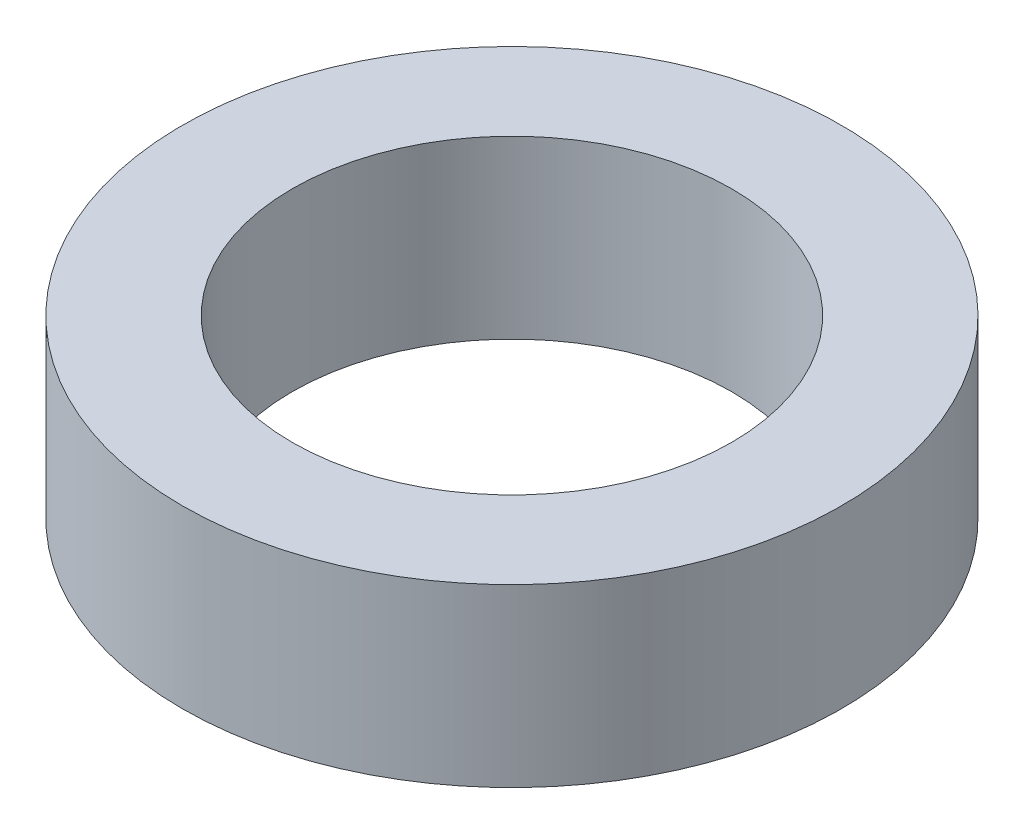
ISO-10303-21;
HEADER;
FILE_DESCRIPTION(('STEP AP214'),'2;1');
FILE_NAME('part.step','',(''),(''),'','','');
FILE_SCHEMA(('AUTOMOTIVE_DESIGN { 1 0 10303 214 1 1 1 1 }'));
ENDSEC;
DATA;
#1=APPLICATION_CONTEXT('core data for automotive mechanical design processes');
#2=APPLICATION_PROTOCOL_DEFINITION('international standard','automotive_design',2000,#1);
#3=PRODUCT_CONTEXT('',#1,'mechanical');
#4=PRODUCT('Part','Part','',(#3));
#5=PRODUCT_RELATED_PRODUCT_CATEGORY('part','',(#4));
#6=PRODUCT_DEFINITION_FORMATION('','',#4);
#7=PRODUCT_DEFINITION_CONTEXT('part definition',#1,'design');
#8=PRODUCT_DEFINITION('design','',#6,#7);
#9=PRODUCT_DEFINITION_SHAPE('','',#8);
#10=(LENGTH_UNIT() NAMED_UNIT(*) SI_UNIT(.MILLI.,.METRE.));
#11=(NAMED_UNIT(*) PLANE_ANGLE_UNIT() SI_UNIT($,.RADIAN.));
#12=(NAMED_UNIT(*) SI_UNIT($,.STERADIAN.) SOLID_ANGLE_UNIT());
#13=UNCERTAINTY_MEASURE_WITH_UNIT(LENGTH_MEASURE(1.E-05),#10,'distance_accuracy_value','');
#14=(GEOMETRIC_REPRESENTATION_CONTEXT(3) GLOBAL_UNCERTAINTY_ASSIGNED_CONTEXT((#13)) GLOBAL_UNIT_ASSIGNED_CONTEXT((#10,
#11,#12)) REPRESENTATION_CONTEXT('',''));
#15=CARTESIAN_POINT('',(0.,0.,0.));
#16=DIRECTION('',(0.,0.,1.));
#17=DIRECTION('',(1.,0.,0.));
#18=AXIS2_PLACEMENT_3D('',#15,#16,#17);
#19=CARTESIAN_POINT('',(0.,4.,0.));
#20=DIRECTION('',(0.,1.,0.));
#21=DIRECTION('',(0.,0.,1.));
#22=AXIS2_PLACEMENT_3D('',#19,#20,#21);
#23=PLANE('',#22);
#24=CARTESIAN_POINT('',(0.,4.,0.));
#25=DIRECTION('',(0.,1.,0.));
#26=DIRECTION('',(0.,0.,1.));
#27=AXIS2_PLACEMENT_3D('',#24,#25,#26);
#28=CIRCLE('',#27,7.5);
#29=CARTESIAN_POINT('',(0.,4.,7.5));
#30=VERTEX_POINT('',#29);
#31=EDGE_CURVE('E10',#30,#30,#28,.T.);
#32=ORIENTED_EDGE('',*,*,#31,.T.);
#33=EDGE_LOOP('',(#32));
#34=FACE_BOUND('',#33,.T.);
#35=CARTESIAN_POINT('',(0.,4.,0.));
#36=DIRECTION('',(0.,1.,0.));
#37=DIRECTION('',(0.,0.,1.));
#38=AXIS2_PLACEMENT_3D('',#35,#36,#37);
#39=CIRCLE('',#38,5.);
#40=CARTESIAN_POINT('',(0.,4.,5.));
#41=VERTEX_POINT('',#40);
#42=EDGE_CURVE('E54',#41,#41,#39,.T.);
#43=ORIENTED_EDGE('',*,*,#42,.F.);
#44=EDGE_LOOP('',(#43));
#45=FACE_BOUND('',#44,.T.);
#46=ADVANCED_FACE('F41',(#34,#45),#23,.T.);
#47=CARTESIAN_POINT('',(0.,0.,0.));
#48=DIRECTION('',(0.,1.,0.));
#49=DIRECTION('',(0.,0.,1.));
#50=AXIS2_PLACEMENT_3D('',#47,#48,#49);
#51=PLANE('',#50);
#52=CARTESIAN_POINT('',(0.,0.,0.));
#53=DIRECTION('',(0.,1.,0.));
#54=DIRECTION('',(0.,0.,1.));
#55=AXIS2_PLACEMENT_3D('',#52,#53,#54);
#56=CIRCLE('',#55,7.5);
#57=CARTESIAN_POINT('',(0.,0.,7.5));
#58=VERTEX_POINT('',#57);
#59=EDGE_CURVE('E45',#58,#58,#56,.T.);
#60=ORIENTED_EDGE('',*,*,#59,.F.);
#61=EDGE_LOOP('',(#60));
#62=FACE_BOUND('',#61,.T.);
#63=CARTESIAN_POINT('',(0.,0.,0.));
#64=DIRECTION('',(0.,1.,0.));
#65=DIRECTION('',(0.,0.,1.));
#66=AXIS2_PLACEMENT_3D('',#63,#64,#65);
#67=CIRCLE('',#66,5.);
#68=CARTESIAN_POINT('',(0.,0.,5.));
#69=VERTEX_POINT('',#68);
#70=EDGE_CURVE('E56',#69,#69,#67,.T.);
#71=ORIENTED_EDGE('',*,*,#70,.T.);
#72=EDGE_LOOP('',(#71));
#73=FACE_BOUND('',#72,.T.);
#74=ADVANCED_FACE('F68',(#62,#73),#51,.F.);
#75=CARTESIAN_POINT('',(0.,4.,0.));
#76=DIRECTION('',(0.,-1.,0.));
#77=DIRECTION('',(0.,0.,-1.));
#78=AXIS2_PLACEMENT_3D('',#75,#76,#77);
#79=CYLINDRICAL_SURFACE('',#78,7.5);
#80=ORIENTED_EDGE('',*,*,#31,.F.);
#81=EDGE_LOOP('',(#80));
#82=FACE_BOUND('',#81,.T.);
#83=ORIENTED_EDGE('',*,*,#59,.T.);
#84=EDGE_LOOP('',(#83));
#85=FACE_BOUND('',#84,.T.);
#86=ADVANCED_FACE('F43',(#82,#85),#79,.T.);
#87=CARTESIAN_POINT('',(0.,4.,0.));
#88=DIRECTION('',(0.,-1.,0.));
#89=DIRECTION('',(0.,0.,-1.));
#90=AXIS2_PLACEMENT_3D('',#87,#88,#89);
#91=CYLINDRICAL_SURFACE('',#90,5.);
#92=ORIENTED_EDGE('',*,*,#42,.T.);
#93=EDGE_LOOP('',(#92));
#94=FACE_BOUND('',#93,.T.);
#95=ORIENTED_EDGE('',*,*,#70,.F.);
#96=EDGE_LOOP('',(#95));
#97=FACE_BOUND('',#96,.T.);
#98=ADVANCED_FACE('F64',(#94,#97),#91,.F.);
#99=CLOSED_SHELL('',(#46,#74,#86,#98));
#100=MANIFOLD_SOLID_BREP('B2',#99);
#101=ADVANCED_BREP_SHAPE_REPRESENTATION('',(#18,#100),#14);
#102=SHAPE_DEFINITION_REPRESENTATION(#9,#101);
ENDSEC;
END-ISO-10303-21;
